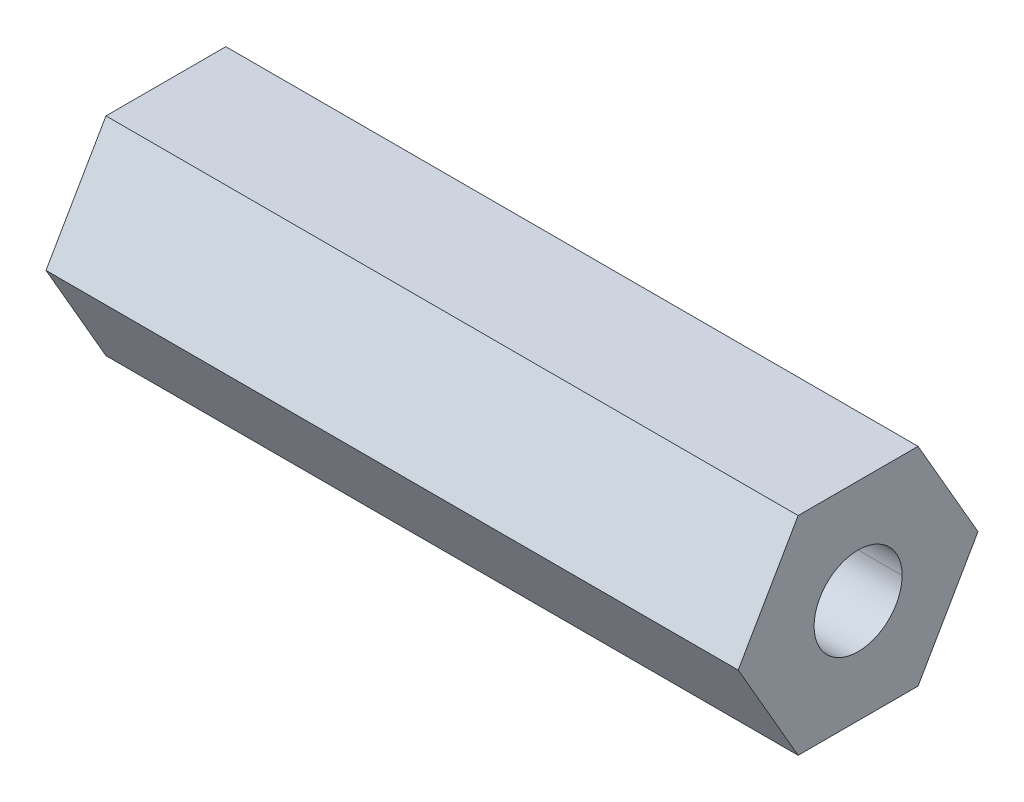
ISO-10303-21;
HEADER;
FILE_DESCRIPTION(('STEP AP214'),'2;1');
FILE_NAME('part.step','',(''),(''),'','','');
FILE_SCHEMA(('AUTOMOTIVE_DESIGN { 1 0 10303 214 1 1 1 1 }'));
ENDSEC;
DATA;
#1=APPLICATION_CONTEXT('core data for automotive mechanical design processes');
#2=APPLICATION_PROTOCOL_DEFINITION('international standard','automotive_design',2000,#1);
#3=PRODUCT_CONTEXT('',#1,'mechanical');
#4=PRODUCT('Part','Part','',(#3));
#5=PRODUCT_RELATED_PRODUCT_CATEGORY('part','',(#4));
#6=PRODUCT_DEFINITION_FORMATION('','',#4);
#7=PRODUCT_DEFINITION_CONTEXT('part definition',#1,'design');
#8=PRODUCT_DEFINITION('design','',#6,#7);
#9=PRODUCT_DEFINITION_SHAPE('','',#8);
#10=(LENGTH_UNIT() NAMED_UNIT(*) SI_UNIT(.MILLI.,.METRE.));
#11=(NAMED_UNIT(*) PLANE_ANGLE_UNIT() SI_UNIT($,.RADIAN.));
#12=(NAMED_UNIT(*) SI_UNIT($,.STERADIAN.) SOLID_ANGLE_UNIT());
#13=UNCERTAINTY_MEASURE_WITH_UNIT(LENGTH_MEASURE(1.E-05),#10,'distance_accuracy_value','');
#14=(GEOMETRIC_REPRESENTATION_CONTEXT(3) GLOBAL_UNCERTAINTY_ASSIGNED_CONTEXT((#13)) GLOBAL_UNIT_ASSIGNED_CONTEXT((#10,
#11,#12)) REPRESENTATION_CONTEXT('',''));
#15=CARTESIAN_POINT('',(0.,0.,0.));
#16=DIRECTION('',(0.,0.,1.));
#17=DIRECTION('',(1.,0.,0.));
#18=AXIS2_PLACEMENT_3D('',#15,#16,#17);
#19=CARTESIAN_POINT('',(38.1,0.,0.));
#20=DIRECTION('',(1.,0.,0.));
#21=DIRECTION('',(0.,0.,-1.));
#22=AXIS2_PLACEMENT_3D('',#19,#20,#21);
#23=CYLINDRICAL_SURFACE('',#22,2.0193);
#24=DIRECTION('',(1.,0.,0.));
#25=VECTOR('',#24,1.);
#26=CARTESIAN_POINT('',(38.1,0.,2.0193));
#27=LINE('',#26,#25);
#28=CARTESIAN_POINT('',(6.35,0.,2.0193));
#29=VERTEX_POINT('',#28);
#30=CARTESIAN_POINT('',(38.1,0.,2.0193));
#31=VERTEX_POINT('',#30);
#32=EDGE_CURVE('E183',#29,#31,#27,.T.);
#33=ORIENTED_EDGE('',*,*,#32,.F.);
#34=CARTESIAN_POINT('',(6.35,0.,0.));
#35=DIRECTION('',(1.,0.,0.));
#36=DIRECTION('',(0.,0.,-1.));
#37=AXIS2_PLACEMENT_3D('',#34,#35,#36);
#38=CIRCLE('',#37,2.0193);
#39=CARTESIAN_POINT('',(6.34999999999999,0.,-2.0193));
#40=VERTEX_POINT('',#39);
#41=EDGE_CURVE('E11',#40,#29,#38,.T.);
#42=ORIENTED_EDGE('',*,*,#41,.F.);
#43=DIRECTION('',(1.,0.,0.));
#44=VECTOR('',#43,1.);
#45=CARTESIAN_POINT('',(38.1,0.,-2.0193));
#46=LINE('',#45,#44);
#47=CARTESIAN_POINT('',(38.1,0.,-2.0193));
#48=VERTEX_POINT('',#47);
#49=EDGE_CURVE('E219',#40,#48,#46,.T.);
#50=ORIENTED_EDGE('',*,*,#49,.T.);
#51=CARTESIAN_POINT('',(38.1,0.,0.));
#52=DIRECTION('',(1.,0.,0.));
#53=DIRECTION('',(0.,0.,-1.));
#54=AXIS2_PLACEMENT_3D('',#51,#52,#53);
#55=CIRCLE('',#54,2.0193);
#56=EDGE_CURVE('E55',#48,#31,#55,.T.);
#57=ORIENTED_EDGE('',*,*,#56,.T.);
#58=EDGE_LOOP('',(#33,#42,#50,#57));
#59=FACE_BOUND('',#58,.T.);
#60=ADVANCED_FACE('F45',(#59),#23,.F.);
#61=CARTESIAN_POINT('',(38.1,0.,0.));
#62=DIRECTION('',(1.,0.,0.));
#63=DIRECTION('',(0.,1.,0.));
#64=AXIS2_PLACEMENT_3D('',#61,#62,#63);
#65=PLANE('',#64);
#66=ORIENTED_EDGE('',*,*,#56,.F.);
#67=CARTESIAN_POINT('',(38.1,0.,0.));
#68=DIRECTION('',(1.,0.,0.));
#69=DIRECTION('',(0.,0.,-1.));
#70=AXIS2_PLACEMENT_3D('',#67,#68,#69);
#71=CIRCLE('',#70,2.0193);
#72=EDGE_CURVE('E49',#31,#48,#71,.T.);
#73=ORIENTED_EDGE('',*,*,#72,.F.);
#74=EDGE_LOOP('',(#66,#73));
#75=FACE_BOUND('',#74,.T.);
#76=DIRECTION('',(0.,0.866025403784442,-0.5));
#77=VECTOR('',#76,1.);
#78=CARTESIAN_POINT('',(38.1,-4.7625,-2.74963065701564));
#79=LINE('',#78,#77);
#80=CARTESIAN_POINT('',(38.1,-4.7625,-2.74963065701564));
#81=VERTEX_POINT('',#80);
#82=CARTESIAN_POINT('',(38.1,0.,-5.49926131403117));
#83=VERTEX_POINT('',#82);
#84=EDGE_CURVE('E194',#81,#83,#79,.T.);
#85=ORIENTED_EDGE('',*,*,#84,.T.);
#86=DIRECTION('',(0.,0.866025403784438,0.5));
#87=VECTOR('',#86,1.);
#88=CARTESIAN_POINT('',(38.1,0.,-5.49926131403117));
#89=LINE('',#88,#87);
#90=CARTESIAN_POINT('',(38.1,4.7625,-2.74963065701557));
#91=VERTEX_POINT('',#90);
#92=EDGE_CURVE('E161',#83,#91,#89,.T.);
#93=ORIENTED_EDGE('',*,*,#92,.T.);
#94=DIRECTION('',(0.,0.,1.));
#95=VECTOR('',#94,1.);
#96=CARTESIAN_POINT('',(38.1,4.7625,-2.74963065701557));
#97=LINE('',#96,#95);
#98=CARTESIAN_POINT('',(38.1,4.7625,2.7496306570156));
#99=VERTEX_POINT('',#98);
#100=EDGE_CURVE('E160',#91,#99,#97,.T.);
#101=ORIENTED_EDGE('',*,*,#100,.T.);
#102=DIRECTION('',(0.,-0.866025403784442,0.5));
#103=VECTOR('',#102,1.);
#104=CARTESIAN_POINT('',(38.1,4.7625,2.7496306570156));
#105=LINE('',#104,#103);
#106=CARTESIAN_POINT('',(38.1,0.,5.49926131403117));
#107=VERTEX_POINT('',#106);
#108=EDGE_CURVE('E157',#99,#107,#105,.T.);
#109=ORIENTED_EDGE('',*,*,#108,.T.);
#110=DIRECTION('',(0.,-0.866025403784435,-0.500000000000007));
#111=VECTOR('',#110,1.);
#112=CARTESIAN_POINT('',(38.1,0.,5.49926131403117));
#113=LINE('',#112,#111);
#114=CARTESIAN_POINT('',(38.1,-4.7625,2.74963065701554));
#115=VERTEX_POINT('',#114);
#116=EDGE_CURVE('E182',#107,#115,#113,.T.);
#117=ORIENTED_EDGE('',*,*,#116,.T.);
#118=DIRECTION('',(0.,0.,-1.));
#119=VECTOR('',#118,1.);
#120=CARTESIAN_POINT('',(38.1,-4.7625,2.74963065701554));
#121=LINE('',#120,#119);
#122=EDGE_CURVE('E77',#115,#81,#121,.T.);
#123=ORIENTED_EDGE('',*,*,#122,.T.);
#124=EDGE_LOOP('',(#85,#93,#101,#109,#117,#123));
#125=FACE_BOUND('',#124,.T.);
#126=ADVANCED_FACE('F201',(#75,#125),#65,.T.);
#127=CARTESIAN_POINT('',(38.1,-4.7625,2.74963065701554));
#128=DIRECTION('',(0.,1.,0.));
#129=DIRECTION('',(0.,0.,-1.));
#130=AXIS2_PLACEMENT_3D('',#127,#128,#129);
#131=PLANE('',#130);
#132=DIRECTION('',(-1.,0.,0.));
#133=VECTOR('',#132,1.);
#134=CARTESIAN_POINT('',(38.1,-4.7625,2.74963065701554));
#135=LINE('',#134,#133);
#136=CARTESIAN_POINT('',(6.34999999999999,-4.76250000000003,2.74963065701553));
#137=VERTEX_POINT('',#136);
#138=EDGE_CURVE('E179',#115,#137,#135,.T.);
#139=ORIENTED_EDGE('',*,*,#138,.T.);
#140=DIRECTION('',(0.,0.,-1.));
#141=VECTOR('',#140,1.);
#142=CARTESIAN_POINT('',(6.34999999999999,-4.7625,-5.49926131403119));
#143=LINE('',#142,#141);
#144=CARTESIAN_POINT('',(6.34999999999999,-4.76250000000001,-2.74963065701564));
#145=VERTEX_POINT('',#144);
#146=EDGE_CURVE('E153',#137,#145,#143,.T.);
#147=ORIENTED_EDGE('',*,*,#146,.T.);
#148=DIRECTION('',(-1.,0.,0.));
#149=VECTOR('',#148,1.);
#150=CARTESIAN_POINT('',(38.1,-4.7625,-2.74963065701564));
#151=LINE('',#150,#149);
#152=EDGE_CURVE('E176',#81,#145,#151,.T.);
#153=ORIENTED_EDGE('',*,*,#152,.F.);
#154=ORIENTED_EDGE('',*,*,#122,.F.);
#155=EDGE_LOOP('',(#139,#147,#153,#154));
#156=FACE_BOUND('',#155,.T.);
#157=ADVANCED_FACE('F204',(#156),#131,.F.);
#158=CARTESIAN_POINT('',(38.1,0.,5.49926131403117));
#159=DIRECTION('',(0.,0.500000000000007,-0.866025403784435));
#160=DIRECTION('',(-1.,0.,0.));
#161=AXIS2_PLACEMENT_3D('',#158,#159,#160);
#162=PLANE('',#161);
#163=DIRECTION('',(-1.,0.,0.));
#164=VECTOR('',#163,1.);
#165=CARTESIAN_POINT('',(38.1,0.,5.49926131403117));
#166=LINE('',#165,#164);
#167=CARTESIAN_POINT('',(6.34999999999999,0.,5.49926131403117));
#168=VERTEX_POINT('',#167);
#169=EDGE_CURVE('E166',#107,#168,#166,.T.);
#170=ORIENTED_EDGE('',*,*,#169,.T.);
#171=DIRECTION('',(0.,-0.866025403784435,-0.500000000000007));
#172=VECTOR('',#171,1.);
#173=CARTESIAN_POINT('',(6.34999999999999,0.,5.49926131403117));
#174=LINE('',#173,#172);
#175=EDGE_CURVE('E138',#168,#137,#174,.T.);
#176=ORIENTED_EDGE('',*,*,#175,.T.);
#177=ORIENTED_EDGE('',*,*,#138,.F.);
#178=ORIENTED_EDGE('',*,*,#116,.F.);
#179=EDGE_LOOP('',(#170,#176,#177,#178));
#180=FACE_BOUND('',#179,.T.);
#181=ADVANCED_FACE('F47',(#180),#162,.F.);
#182=CARTESIAN_POINT('',(38.1,4.7625,2.7496306570156));
#183=DIRECTION('',(0.,-0.5,-0.866025403784442));
#184=DIRECTION('',(0.,-0.866025403784442,0.5));
#185=AXIS2_PLACEMENT_3D('',#182,#183,#184);
#186=PLANE('',#185);
#187=DIRECTION('',(-1.,0.,0.));
#188=VECTOR('',#187,1.);
#189=CARTESIAN_POINT('',(38.1,4.7625,2.7496306570156));
#190=LINE('',#189,#188);
#191=CARTESIAN_POINT('',(6.34999999999999,4.76249999999998,2.7496306570156));
#192=VERTEX_POINT('',#191);
#193=EDGE_CURVE('E149',#99,#192,#190,.T.);
#194=ORIENTED_EDGE('',*,*,#193,.T.);
#195=DIRECTION('',(0.,-0.866025403784439,0.499999999999999));
#196=VECTOR('',#195,1.);
#197=CARTESIAN_POINT('',(6.34999999999999,4.7625,2.7496306570156));
#198=LINE('',#197,#196);
#199=EDGE_CURVE('E133',#192,#168,#198,.T.);
#200=ORIENTED_EDGE('',*,*,#199,.T.);
#201=ORIENTED_EDGE('',*,*,#169,.F.);
#202=ORIENTED_EDGE('',*,*,#108,.F.);
#203=EDGE_LOOP('',(#194,#200,#201,#202));
#204=FACE_BOUND('',#203,.T.);
#205=ADVANCED_FACE('F155',(#204),#186,.F.);
#206=CARTESIAN_POINT('',(38.1,4.7625,-2.74963065701557));
#207=DIRECTION('',(0.,-1.,0.));
#208=DIRECTION('',(0.,0.,-1.));
#209=AXIS2_PLACEMENT_3D('',#206,#207,#208);
#210=PLANE('',#209);
#211=DIRECTION('',(-1.,0.,0.));
#212=VECTOR('',#211,1.);
#213=CARTESIAN_POINT('',(38.1,4.7625,-2.74963065701557));
#214=LINE('',#213,#212);
#215=CARTESIAN_POINT('',(6.34999999999999,4.7625,-2.74963065701558));
#216=VERTEX_POINT('',#215);
#217=EDGE_CURVE('E151',#91,#216,#214,.T.);
#218=ORIENTED_EDGE('',*,*,#217,.T.);
#219=DIRECTION('',(0.,0.,-1.));
#220=VECTOR('',#219,1.);
#221=CARTESIAN_POINT('',(6.34999999999999,4.76250000000001,-5.49926131403115));
#222=LINE('',#221,#220);
#223=EDGE_CURVE('E136',#192,#216,#222,.T.);
#224=ORIENTED_EDGE('',*,*,#223,.F.);
#225=ORIENTED_EDGE('',*,*,#193,.F.);
#226=ORIENTED_EDGE('',*,*,#100,.F.);
#227=EDGE_LOOP('',(#218,#224,#225,#226));
#228=FACE_BOUND('',#227,.T.);
#229=ADVANCED_FACE('F148',(#228),#210,.F.);
#230=CARTESIAN_POINT('',(38.1,0.,-5.49926131403117));
#231=DIRECTION('',(0.,-0.5,0.866025403784438));
#232=DIRECTION('',(-1.,0.,0.));
#233=AXIS2_PLACEMENT_3D('',#230,#231,#232);
#234=PLANE('',#233);
#235=DIRECTION('',(-1.,0.,0.));
#236=VECTOR('',#235,1.);
#237=CARTESIAN_POINT('',(38.1,0.,-5.49926131403117));
#238=LINE('',#237,#236);
#239=CARTESIAN_POINT('',(6.34999999999999,0.,-5.49926131403117));
#240=VERTEX_POINT('',#239);
#241=EDGE_CURVE('E172',#83,#240,#238,.T.);
#242=ORIENTED_EDGE('',*,*,#241,.T.);
#243=DIRECTION('',(0.,0.866025403784438,0.5));
#244=VECTOR('',#243,1.);
#245=CARTESIAN_POINT('',(6.34999999999999,0.,-5.49926131403117));
#246=LINE('',#245,#244);
#247=EDGE_CURVE('E63',#240,#216,#246,.T.);
#248=ORIENTED_EDGE('',*,*,#247,.T.);
#249=ORIENTED_EDGE('',*,*,#217,.F.);
#250=ORIENTED_EDGE('',*,*,#92,.F.);
#251=EDGE_LOOP('',(#242,#248,#249,#250));
#252=FACE_BOUND('',#251,.T.);
#253=ADVANCED_FACE('F303',(#252),#234,.F.);
#254=CARTESIAN_POINT('',(38.1,-4.7625,-2.74963065701564));
#255=DIRECTION('',(0.,0.5,0.866025403784442));
#256=DIRECTION('',(1.,0.,0.));
#257=AXIS2_PLACEMENT_3D('',#254,#255,#256);
#258=PLANE('',#257);
#259=ORIENTED_EDGE('',*,*,#152,.T.);
#260=DIRECTION('',(0.,0.866025403784439,-0.499999999999999));
#261=VECTOR('',#260,1.);
#262=CARTESIAN_POINT('',(6.34999999999999,-4.7625,-2.74963065701564));
#263=LINE('',#262,#261);
#264=EDGE_CURVE('E208',#145,#240,#263,.T.);
#265=ORIENTED_EDGE('',*,*,#264,.T.);
#266=ORIENTED_EDGE('',*,*,#241,.F.);
#267=ORIENTED_EDGE('',*,*,#84,.F.);
#268=EDGE_LOOP('',(#259,#265,#266,#267));
#269=FACE_BOUND('',#268,.T.);
#270=ADVANCED_FACE('F211',(#269),#258,.F.);
#271=CARTESIAN_POINT('',(38.1,0.,0.));
#272=DIRECTION('',(1.,0.,0.));
#273=DIRECTION('',(0.,0.,-1.));
#274=AXIS2_PLACEMENT_3D('',#271,#272,#273);
#275=CYLINDRICAL_SURFACE('',#274,2.0193);
#276=CARTESIAN_POINT('',(6.35,0.,0.));
#277=DIRECTION('',(1.,0.,0.));
#278=DIRECTION('',(0.,0.,-1.));
#279=AXIS2_PLACEMENT_3D('',#276,#277,#278);
#280=CIRCLE('',#279,2.0193);
#281=EDGE_CURVE('E187',#29,#40,#280,.T.);
#282=ORIENTED_EDGE('',*,*,#281,.F.);
#283=ORIENTED_EDGE('',*,*,#32,.T.);
#284=ORIENTED_EDGE('',*,*,#72,.T.);
#285=ORIENTED_EDGE('',*,*,#49,.F.);
#286=EDGE_LOOP('',(#282,#283,#284,#285));
#287=FACE_BOUND('',#286,.T.);
#288=ADVANCED_FACE('F291',(#287),#275,.F.);
#289=CARTESIAN_POINT('',(6.34999999999999,-4.7625,-5.49926131403119));
#290=DIRECTION('',(1.,0.,0.));
#291=DIRECTION('',(0.,0.,-1.));
#292=AXIS2_PLACEMENT_3D('',#289,#290,#291);
#293=PLANE('',#292);
#294=ORIENTED_EDGE('',*,*,#281,.T.);
#295=ORIENTED_EDGE('',*,*,#41,.T.);
#296=EDGE_LOOP('',(#294,#295));
#297=FACE_BOUND('',#296,.T.);
#298=ORIENTED_EDGE('',*,*,#199,.F.);
#299=ORIENTED_EDGE('',*,*,#223,.T.);
#300=ORIENTED_EDGE('',*,*,#247,.F.);
#301=ORIENTED_EDGE('',*,*,#264,.F.);
#302=ORIENTED_EDGE('',*,*,#146,.F.);
#303=ORIENTED_EDGE('',*,*,#175,.F.);
#304=EDGE_LOOP('',(#298,#299,#300,#301,#302,#303));
#305=FACE_BOUND('',#304,.T.);
#306=ADVANCED_FACE('F135',(#297,#305),#293,.F.);
#307=CLOSED_SHELL('',(#60,#126,#157,#181,#205,#229,#253,#270,#288,#306));
#308=MANIFOLD_SOLID_BREP('B2',#307);
#309=ADVANCED_BREP_SHAPE_REPRESENTATION('',(#18,#308),#14);
#310=SHAPE_DEFINITION_REPRESENTATION(#9,#309);
ENDSEC;
END-ISO-10303-21;
